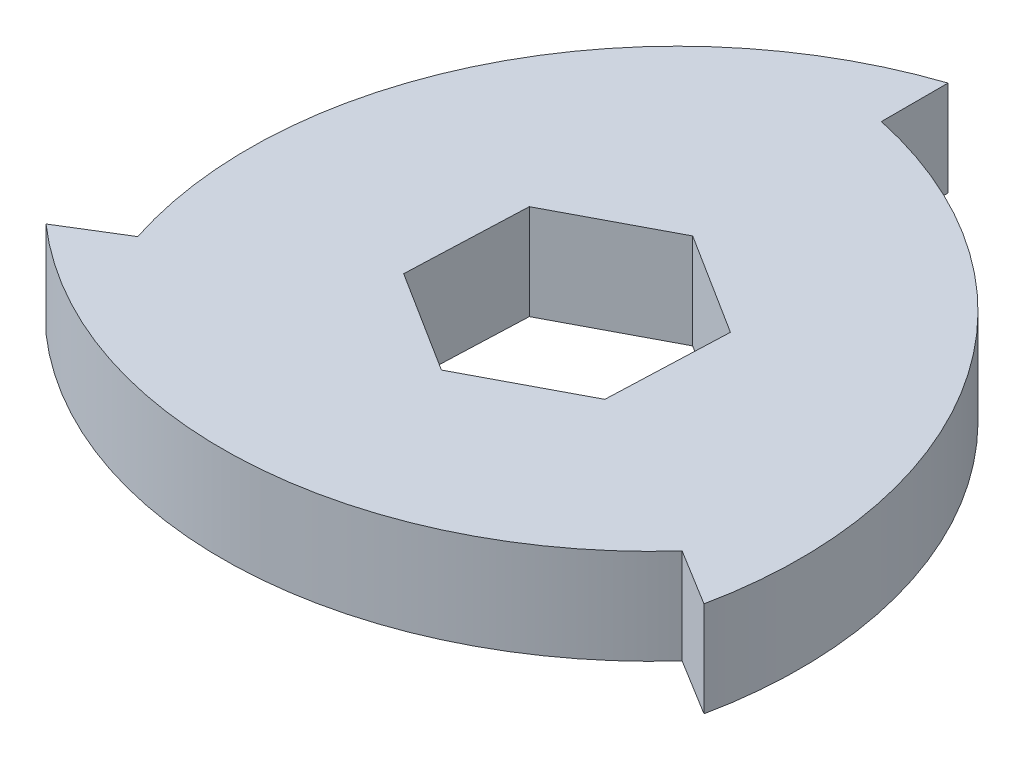
ISO-10303-21;
HEADER;
FILE_DESCRIPTION(('STEP AP214'),'2;1');
FILE_NAME('part.step','',(''),(''),'','','');
FILE_SCHEMA(('AUTOMOTIVE_DESIGN { 1 0 10303 214 1 1 1 1 }'));
ENDSEC;
DATA;
#1=APPLICATION_CONTEXT('core data for automotive mechanical design processes');
#2=APPLICATION_PROTOCOL_DEFINITION('international standard','automotive_design',2000,#1);
#3=PRODUCT_CONTEXT('',#1,'mechanical');
#4=PRODUCT('Part','Part','',(#3));
#5=PRODUCT_RELATED_PRODUCT_CATEGORY('part','',(#4));
#6=PRODUCT_DEFINITION_FORMATION('','',#4);
#7=PRODUCT_DEFINITION_CONTEXT('part definition',#1,'design');
#8=PRODUCT_DEFINITION('design','',#6,#7);
#9=PRODUCT_DEFINITION_SHAPE('','',#8);
#10=(LENGTH_UNIT() NAMED_UNIT(*) SI_UNIT(.MILLI.,.METRE.));
#11=(NAMED_UNIT(*) PLANE_ANGLE_UNIT() SI_UNIT($,.RADIAN.));
#12=(NAMED_UNIT(*) SI_UNIT($,.STERADIAN.) SOLID_ANGLE_UNIT());
#13=UNCERTAINTY_MEASURE_WITH_UNIT(LENGTH_MEASURE(1.E-05),#10,'distance_accuracy_value','');
#14=(GEOMETRIC_REPRESENTATION_CONTEXT(3) GLOBAL_UNCERTAINTY_ASSIGNED_CONTEXT((#13)) GLOBAL_UNIT_ASSIGNED_CONTEXT((#10,
#11,#12)) REPRESENTATION_CONTEXT('',''));
#15=CARTESIAN_POINT('',(0.,0.,0.));
#16=DIRECTION('',(0.,0.,1.));
#17=DIRECTION('',(1.,0.,0.));
#18=AXIS2_PLACEMENT_3D('',#15,#16,#17);
#19=CARTESIAN_POINT('',(0.,10.,0.));
#20=DIRECTION('',(0.,1.,0.));
#21=DIRECTION('',(0.,0.,1.));
#22=AXIS2_PLACEMENT_3D('',#19,#20,#21);
#23=PLANE('',#22);
#24=DIRECTION('',(0.0393377719648959,0.,-0.999225970287421));
#25=VECTOR('',#24,1.);
#26=CARTESIAN_POINT('',(10.9889498495241,10.,0.432615660689758));
#27=LINE('',#26,#25);
#28=CARTESIAN_POINT('',(10.7391175137902,10.,6.77865270380765));
#29=VERTEX_POINT('',#28);
#30=CARTESIAN_POINT('',(11.2387743249217,10.,-5.91322172057992));
#31=VERTEX_POINT('',#30);
#32=EDGE_CURVE('E155',#29,#31,#27,.T.);
#33=ORIENTED_EDGE('',*,*,#32,.F.);
#34=DIRECTION('',(0.885023960372509,0.,-0.465545475293831));
#35=VECTOR('',#34,1.);
#36=CARTESIAN_POINT('',(5.12044978081298,10.,9.73421713752762));
#37=LINE('',#36,#35);
#38=CARTESIAN_POINT('',(-0.502196564937244,10.,12.6918744243876));
#39=VERTEX_POINT('',#38);
#40=EDGE_CURVE('E237',#39,#29,#37,.T.);
#41=ORIENTED_EDGE('',*,*,#40,.F.);
#42=DIRECTION('',(0.845686188407613,0.,0.533680494993589));
#43=VECTOR('',#42,1.);
#44=CARTESIAN_POINT('',(-5.87120880458136,10.,9.30369432997785));
#45=LINE('',#44,#43);
#46=CARTESIAN_POINT('',(-11.2438538325331,10.,5.91322172057993));
#47=VERTEX_POINT('',#46);
#48=EDGE_CURVE('E264',#47,#39,#45,.T.);
#49=ORIENTED_EDGE('',*,*,#48,.F.);
#50=DIRECTION('',(-0.0393377719648957,0.,0.999225970287421));
#51=VECTOR('',#50,1.);
#52=CARTESIAN_POINT('',(-10.9940214967991,10.,-0.43281532253795));
#53=LINE('',#52,#51);
#54=CARTESIAN_POINT('',(-10.7441970214015,10.,-6.77865270380763));
#55=VERTEX_POINT('',#54);
#56=EDGE_CURVE('E261',#55,#47,#53,.T.);
#57=ORIENTED_EDGE('',*,*,#56,.F.);
#58=DIRECTION('',(-0.885023960372509,0.,0.465545475293831));
#59=VECTOR('',#58,1.);
#60=CARTESIAN_POINT('',(-5.12155067565131,10.,-9.7363099906676));
#61=LINE('',#60,#59);
#62=CARTESIAN_POINT('',(0.49711705732587,10.,-12.6918744243876));
#63=VERTEX_POINT('',#62);
#64=EDGE_CURVE('E258',#63,#55,#61,.T.);
#65=ORIENTED_EDGE('',*,*,#64,.F.);
#66=DIRECTION('',(-0.845686188407613,0.,-0.53368049499359));
#67=VECTOR('',#66,1.);
#68=CARTESIAN_POINT('',(5.86976208527761,10.,-9.30140181498965));
#69=LINE('',#68,#67);
#70=EDGE_CURVE('E251',#31,#63,#69,.T.);
#71=ORIENTED_EDGE('',*,*,#70,.F.);
#72=EDGE_LOOP('',(#33,#41,#49,#57,#65,#71));
#73=FACE_BOUND('',#72,.T.);
#74=DIRECTION('',(0.,0.,1.));
#75=VECTOR('',#74,1.);
#76=CARTESIAN_POINT('',(0.,10.,0.));
#77=LINE('',#76,#75);
#78=CARTESIAN_POINT('',(0.,10.,-40.));
#79=VERTEX_POINT('',#78);
#80=CARTESIAN_POINT('',(0.,10.,-33.));
#81=VERTEX_POINT('',#80);
#82=EDGE_CURVE('E281',#79,#81,#77,.T.);
#83=ORIENTED_EDGE('',*,*,#82,.F.);
#84=CARTESIAN_POINT('',(14.246243831083,10.,2.68541362931054));
#85=DIRECTION('',(0.,1.,0.));
#86=DIRECTION('',(0.,0.,1.));
#87=AXIS2_PLACEMENT_3D('',#84,#85,#86);
#88=CIRCLE('',#87,45.);
#89=CARTESIAN_POINT('',(-28.5801082017894,10.,16.5021994913151));
#90=VERTEX_POINT('',#89);
#91=EDGE_CURVE('E293',#90,#79,#88,.F.);
#92=ORIENTED_EDGE('',*,*,#91,.F.);
#93=DIRECTION('',(-0.851877214661231,0.,0.523741549947131));
#94=VECTOR('',#93,1.);
#95=CARTESIAN_POINT('',(-0.476993651270899,10.,-0.775840723533893));
#96=LINE('',#95,#94);
#97=CARTESIAN_POINT('',(-34.543248704418,10.,20.168390340945));
#98=VERTEX_POINT('',#97);
#99=EDGE_CURVE('E296',#90,#98,#96,.T.);
#100=ORIENTED_EDGE('',*,*,#99,.T.);
#101=CARTESIAN_POINT('',(-4.83835516385309,10.,-13.6342619180675));
#102=DIRECTION('',(0.,1.,0.));
#103=DIRECTION('',(0.,0.,1.));
#104=AXIS2_PLACEMENT_3D('',#101,#102,#103);
#105=CIRCLE('',#104,45.0000000000001);
#106=CARTESIAN_POINT('',(28.5801082017892,10.,16.5021994913155));
#107=VERTEX_POINT('',#106);
#108=EDGE_CURVE('E310',#107,#98,#105,.F.);
#109=ORIENTED_EDGE('',*,*,#108,.F.);
#110=DIRECTION('',(0.851877214661262,0.,0.52374154994708));
#111=VECTOR('',#110,1.);
#112=CARTESIAN_POINT('',(0.476993651269617,10.,-0.77584072353191));
#113=LINE('',#112,#111);
#114=CARTESIAN_POINT('',(34.543248704418,10.,20.168390340945));
#115=VERTEX_POINT('',#114);
#116=EDGE_CURVE('E307',#107,#115,#113,.T.);
#117=ORIENTED_EDGE('',*,*,#116,.T.);
#118=CARTESIAN_POINT('',(-9.50947322888466,10.,10.9837460763533));
#119=DIRECTION('',(0.,1.,0.));
#120=DIRECTION('',(0.,0.,1.));
#121=AXIS2_PLACEMENT_3D('',#118,#119,#120);
#122=CIRCLE('',#121,44.9999999999999);
#123=EDGE_CURVE('E284',#81,#115,#122,.F.);
#124=ORIENTED_EDGE('',*,*,#123,.F.);
#125=EDGE_LOOP('',(#83,#92,#100,#109,#117,#124));
#126=FACE_BOUND('',#125,.T.);
#127=ADVANCED_FACE('F140',(#73,#126),#23,.T.);
#128=CARTESIAN_POINT('',(0.,0.,0.));
#129=DIRECTION('',(0.,1.,0.));
#130=DIRECTION('',(0.,0.,1.));
#131=AXIS2_PLACEMENT_3D('',#128,#129,#130);
#132=PLANE('',#131);
#133=DIRECTION('',(-0.885023960372509,0.,0.465545475293831));
#134=VECTOR('',#133,1.);
#135=CARTESIAN_POINT('',(5.12044978081298,0.,9.73421713752762));
#136=LINE('',#135,#134);
#137=CARTESIAN_POINT('',(10.7391175137902,0.,6.77865270380765));
#138=VERTEX_POINT('',#137);
#139=CARTESIAN_POINT('',(-0.502196564937244,0.,12.6918744243876));
#140=VERTEX_POINT('',#139);
#141=EDGE_CURVE('E249',#138,#140,#136,.T.);
#142=ORIENTED_EDGE('',*,*,#141,.F.);
#143=DIRECTION('',(-0.0393377719648959,0.,0.999225970287421));
#144=VECTOR('',#143,1.);
#145=CARTESIAN_POINT('',(10.9889498495241,0.,0.432615660689758));
#146=LINE('',#145,#144);
#147=CARTESIAN_POINT('',(11.2387743249217,0.,-5.91322172057992));
#148=VERTEX_POINT('',#147);
#149=EDGE_CURVE('E231',#148,#138,#146,.T.);
#150=ORIENTED_EDGE('',*,*,#149,.F.);
#151=DIRECTION('',(0.845686188407613,0.,0.53368049499359));
#152=VECTOR('',#151,1.);
#153=CARTESIAN_POINT('',(5.86976208527761,0.,-9.30140181498965));
#154=LINE('',#153,#152);
#155=CARTESIAN_POINT('',(0.49711705732587,0.,-12.6918744243876));
#156=VERTEX_POINT('',#155);
#157=EDGE_CURVE('E240',#156,#148,#154,.T.);
#158=ORIENTED_EDGE('',*,*,#157,.F.);
#159=DIRECTION('',(0.885023960372509,0.,-0.465545475293831));
#160=VECTOR('',#159,1.);
#161=CARTESIAN_POINT('',(-5.12155067565131,0.,-9.7363099906676));
#162=LINE('',#161,#160);
#163=CARTESIAN_POINT('',(-10.7441970214015,0.,-6.77865270380763));
#164=VERTEX_POINT('',#163);
#165=EDGE_CURVE('E163',#164,#156,#162,.T.);
#166=ORIENTED_EDGE('',*,*,#165,.F.);
#167=DIRECTION('',(0.0393377719648957,0.,-0.999225970287421));
#168=VECTOR('',#167,1.);
#169=CARTESIAN_POINT('',(-10.9940214967991,0.,-0.43281532253795));
#170=LINE('',#169,#168);
#171=CARTESIAN_POINT('',(-11.2438538325331,0.,5.91322172057993));
#172=VERTEX_POINT('',#171);
#173=EDGE_CURVE('E441',#172,#164,#170,.T.);
#174=ORIENTED_EDGE('',*,*,#173,.F.);
#175=DIRECTION('',(-0.845686188407613,0.,-0.533680494993589));
#176=VECTOR('',#175,1.);
#177=CARTESIAN_POINT('',(-5.87120880458136,0.,9.30369432997785));
#178=LINE('',#177,#176);
#179=EDGE_CURVE('E253',#140,#172,#178,.T.);
#180=ORIENTED_EDGE('',*,*,#179,.F.);
#181=EDGE_LOOP('',(#142,#150,#158,#166,#174,#180));
#182=FACE_BOUND('',#181,.T.);
#183=CARTESIAN_POINT('',(14.246243831083,0.,2.68541362931054));
#184=DIRECTION('',(0.,1.,0.));
#185=DIRECTION('',(0.,0.,1.));
#186=AXIS2_PLACEMENT_3D('',#183,#184,#185);
#187=CIRCLE('',#186,45.);
#188=CARTESIAN_POINT('',(0.,0.,-40.));
#189=VERTEX_POINT('',#188);
#190=CARTESIAN_POINT('',(-28.5801082017894,0.,16.5021994913151));
#191=VERTEX_POINT('',#190);
#192=EDGE_CURVE('E289',#189,#191,#187,.T.);
#193=ORIENTED_EDGE('',*,*,#192,.F.);
#194=DIRECTION('',(0.,0.,-1.));
#195=VECTOR('',#194,1.);
#196=CARTESIAN_POINT('',(0.,0.,0.));
#197=LINE('',#196,#195);
#198=CARTESIAN_POINT('',(0.,0.,-32.9999999999999));
#199=VERTEX_POINT('',#198);
#200=EDGE_CURVE('E277',#199,#189,#197,.T.);
#201=ORIENTED_EDGE('',*,*,#200,.F.);
#202=CARTESIAN_POINT('',(-9.50947322888466,0.,10.9837460763533));
#203=DIRECTION('',(0.,1.,0.));
#204=DIRECTION('',(0.,0.,1.));
#205=AXIS2_PLACEMENT_3D('',#202,#203,#204);
#206=CIRCLE('',#205,44.9999999999999);
#207=CARTESIAN_POINT('',(34.543248704418,0.,20.168390340945));
#208=VERTEX_POINT('',#207);
#209=EDGE_CURVE('E280',#208,#199,#206,.T.);
#210=ORIENTED_EDGE('',*,*,#209,.F.);
#211=DIRECTION('',(-0.851877214661262,0.,-0.52374154994708));
#212=VECTOR('',#211,1.);
#213=CARTESIAN_POINT('',(0.476993651269617,0.,-0.77584072353191));
#214=LINE('',#213,#212);
#215=CARTESIAN_POINT('',(28.5801082017892,0.,16.5021994913155));
#216=VERTEX_POINT('',#215);
#217=EDGE_CURVE('E292',#208,#216,#214,.T.);
#218=ORIENTED_EDGE('',*,*,#217,.T.);
#219=CARTESIAN_POINT('',(-4.83835516385309,0.,-13.6342619180675));
#220=DIRECTION('',(0.,1.,0.));
#221=DIRECTION('',(0.,0.,1.));
#222=AXIS2_PLACEMENT_3D('',#219,#220,#221);
#223=CIRCLE('',#222,45.0000000000001);
#224=CARTESIAN_POINT('',(-34.5432487044181,0.,20.1683903409448));
#225=VERTEX_POINT('',#224);
#226=EDGE_CURVE('E12',#225,#216,#223,.T.);
#227=ORIENTED_EDGE('',*,*,#226,.F.);
#228=DIRECTION('',(0.851877214661231,0.,-0.523741549947131));
#229=VECTOR('',#228,1.);
#230=CARTESIAN_POINT('',(-0.476993651270899,0.,-0.775840723533893));
#231=LINE('',#230,#229);
#232=EDGE_CURVE('E279',#225,#191,#231,.T.);
#233=ORIENTED_EDGE('',*,*,#232,.T.);
#234=EDGE_LOOP('',(#193,#201,#210,#218,#227,#233));
#235=FACE_BOUND('',#234,.T.);
#236=ADVANCED_FACE('F142',(#182,#235),#132,.F.);
#237=CARTESIAN_POINT('',(0.476993651269617,-0.000999999999999265,-0.77584072353191));
#238=DIRECTION('',(-0.52374154994708,0.,0.851877214661262));
#239=DIRECTION('',(0.851877214661262,0.,0.52374154994708));
#240=AXIS2_PLACEMENT_3D('',#237,#238,#239);
#241=PLANE('',#240);
#242=DIRECTION('',(0.,1.,0.));
#243=VECTOR('',#242,1.);
#244=CARTESIAN_POINT('',(34.543248704418,-0.000999999999999265,20.168390340945));
#245=LINE('',#244,#243);
#246=EDGE_CURVE('E148',#208,#115,#245,.T.);
#247=ORIENTED_EDGE('',*,*,#246,.T.);
#248=ORIENTED_EDGE('',*,*,#116,.F.);
#249=DIRECTION('',(0.,1.,0.));
#250=VECTOR('',#249,1.);
#251=CARTESIAN_POINT('',(28.5801082017892,-0.000999999999999265,16.5021994913155));
#252=LINE('',#251,#250);
#253=EDGE_CURVE('E313',#216,#107,#252,.T.);
#254=ORIENTED_EDGE('',*,*,#253,.F.);
#255=ORIENTED_EDGE('',*,*,#217,.F.);
#256=EDGE_LOOP('',(#247,#248,#254,#255));
#257=FACE_BOUND('',#256,.T.);
#258=ADVANCED_FACE('F325',(#257),#241,.T.);
#259=CARTESIAN_POINT('',(-4.83835516385309,-0.000999999999999265,-13.6342619180675));
#260=DIRECTION('',(0.,1.,0.));
#261=DIRECTION('',(0.,0.,1.));
#262=AXIS2_PLACEMENT_3D('',#259,#260,#261);
#263=CYLINDRICAL_SURFACE('',#262,45.0000000000001);
#264=ORIENTED_EDGE('',*,*,#226,.T.);
#265=ORIENTED_EDGE('',*,*,#253,.T.);
#266=ORIENTED_EDGE('',*,*,#108,.T.);
#267=DIRECTION('',(0.,1.,0.));
#268=VECTOR('',#267,1.);
#269=CARTESIAN_POINT('',(-34.543248704418,-0.000999999999999265,20.168390340945));
#270=LINE('',#269,#268);
#271=EDGE_CURVE('E316',#225,#98,#270,.T.);
#272=ORIENTED_EDGE('',*,*,#271,.F.);
#273=EDGE_LOOP('',(#264,#265,#266,#272));
#274=FACE_BOUND('',#273,.T.);
#275=ADVANCED_FACE('F319',(#274),#263,.T.);
#276=CARTESIAN_POINT('',(-0.476993651270899,-0.000999999999999265,-0.775840723533893));
#277=DIRECTION('',(-0.523741549947131,0.,-0.851877214661231));
#278=DIRECTION('',(-0.851877214661231,0.,0.523741549947131));
#279=AXIS2_PLACEMENT_3D('',#276,#277,#278);
#280=PLANE('',#279);
#281=ORIENTED_EDGE('',*,*,#271,.T.);
#282=ORIENTED_EDGE('',*,*,#99,.F.);
#283=DIRECTION('',(0.,1.,0.));
#284=VECTOR('',#283,1.);
#285=CARTESIAN_POINT('',(-28.5801082017894,-0.000999999999999265,16.5021994913151));
#286=LINE('',#285,#284);
#287=EDGE_CURVE('E294',#191,#90,#286,.T.);
#288=ORIENTED_EDGE('',*,*,#287,.F.);
#289=ORIENTED_EDGE('',*,*,#232,.F.);
#290=EDGE_LOOP('',(#281,#282,#288,#289));
#291=FACE_BOUND('',#290,.T.);
#292=ADVANCED_FACE('F332',(#291),#280,.T.);
#293=CARTESIAN_POINT('',(14.246243831083,-0.000999999999999265,2.68541362931054));
#294=DIRECTION('',(0.,1.,0.));
#295=DIRECTION('',(0.,0.,1.));
#296=AXIS2_PLACEMENT_3D('',#293,#294,#295);
#297=CYLINDRICAL_SURFACE('',#296,45.);
#298=ORIENTED_EDGE('',*,*,#192,.T.);
#299=ORIENTED_EDGE('',*,*,#287,.T.);
#300=ORIENTED_EDGE('',*,*,#91,.T.);
#301=DIRECTION('',(0.,1.,0.));
#302=VECTOR('',#301,1.);
#303=CARTESIAN_POINT('',(0.,-0.000999999999999265,-40.));
#304=LINE('',#303,#302);
#305=EDGE_CURVE('E297',#189,#79,#304,.T.);
#306=ORIENTED_EDGE('',*,*,#305,.F.);
#307=EDGE_LOOP('',(#298,#299,#300,#306));
#308=FACE_BOUND('',#307,.T.);
#309=ADVANCED_FACE('F341',(#308),#297,.T.);
#310=CARTESIAN_POINT('',(0.,-0.000999999999999265,0.));
#311=DIRECTION('',(-1.,0.,0.));
#312=DIRECTION('',(0.,0.,1.));
#313=AXIS2_PLACEMENT_3D('',#310,#311,#312);
#314=PLANE('',#313);
#315=ORIENTED_EDGE('',*,*,#200,.T.);
#316=ORIENTED_EDGE('',*,*,#305,.T.);
#317=ORIENTED_EDGE('',*,*,#82,.T.);
#318=DIRECTION('',(0.,1.,0.));
#319=VECTOR('',#318,1.);
#320=CARTESIAN_POINT('',(0.,-0.000999999999999265,-33.));
#321=LINE('',#320,#319);
#322=EDGE_CURVE('E243',#199,#81,#321,.T.);
#323=ORIENTED_EDGE('',*,*,#322,.F.);
#324=EDGE_LOOP('',(#315,#316,#317,#323));
#325=FACE_BOUND('',#324,.T.);
#326=ADVANCED_FACE('F342',(#325),#314,.F.);
#327=CARTESIAN_POINT('',(-9.50947322888466,-0.000999999999999265,10.9837460763533));
#328=DIRECTION('',(0.,1.,0.));
#329=DIRECTION('',(0.,0.,1.));
#330=AXIS2_PLACEMENT_3D('',#327,#328,#329);
#331=CYLINDRICAL_SURFACE('',#330,44.9999999999999);
#332=ORIENTED_EDGE('',*,*,#209,.T.);
#333=ORIENTED_EDGE('',*,*,#322,.T.);
#334=ORIENTED_EDGE('',*,*,#123,.T.);
#335=ORIENTED_EDGE('',*,*,#246,.F.);
#336=EDGE_LOOP('',(#332,#333,#334,#335));
#337=FACE_BOUND('',#336,.T.);
#338=ADVANCED_FACE('F337',(#337),#331,.T.);
#339=CARTESIAN_POINT('',(10.9889498495241,-0.000999999999999265,0.432615660689758));
#340=DIRECTION('',(0.999225970287421,0.,0.0393377719648959));
#341=DIRECTION('',(0.0393377719648959,0.,-0.999225970287421));
#342=AXIS2_PLACEMENT_3D('',#339,#340,#341);
#343=PLANE('',#342);
#344=ORIENTED_EDGE('',*,*,#149,.T.);
#345=DIRECTION('',(0.,1.,0.));
#346=VECTOR('',#345,1.);
#347=CARTESIAN_POINT('',(10.7391175137902,-0.000999999999999265,6.77865270380765));
#348=LINE('',#347,#346);
#349=EDGE_CURVE('E244',#138,#29,#348,.T.);
#350=ORIENTED_EDGE('',*,*,#349,.T.);
#351=ORIENTED_EDGE('',*,*,#32,.T.);
#352=DIRECTION('',(0.,1.,0.));
#353=VECTOR('',#352,1.);
#354=CARTESIAN_POINT('',(11.2387743249217,-0.000999999999999265,-5.91322172057992));
#355=LINE('',#354,#353);
#356=EDGE_CURVE('E227',#148,#31,#355,.T.);
#357=ORIENTED_EDGE('',*,*,#356,.F.);
#358=EDGE_LOOP('',(#344,#350,#351,#357));
#359=FACE_BOUND('',#358,.T.);
#360=ADVANCED_FACE('F229',(#359),#343,.F.);
#361=CARTESIAN_POINT('',(5.12044978081298,-0.000999999999999265,9.73421713752762));
#362=DIRECTION('',(0.465545475293831,0.,0.885023960372509));
#363=DIRECTION('',(0.885023960372509,0.,-0.465545475293831));
#364=AXIS2_PLACEMENT_3D('',#361,#362,#363);
#365=PLANE('',#364);
#366=ORIENTED_EDGE('',*,*,#141,.T.);
#367=DIRECTION('',(0.,1.,0.));
#368=VECTOR('',#367,1.);
#369=CARTESIAN_POINT('',(-0.502196564937244,-0.000999999999999265,12.6918744243876));
#370=LINE('',#369,#368);
#371=EDGE_CURVE('E270',#140,#39,#370,.T.);
#372=ORIENTED_EDGE('',*,*,#371,.T.);
#373=ORIENTED_EDGE('',*,*,#40,.T.);
#374=ORIENTED_EDGE('',*,*,#349,.F.);
#375=EDGE_LOOP('',(#366,#372,#373,#374));
#376=FACE_BOUND('',#375,.T.);
#377=ADVANCED_FACE('F389',(#376),#365,.F.);
#378=CARTESIAN_POINT('',(-5.87120880458136,-0.000999999999999265,9.30369432997785));
#379=DIRECTION('',(-0.533680494993589,0.,0.845686188407613));
#380=DIRECTION('',(0.845686188407613,0.,0.533680494993589));
#381=AXIS2_PLACEMENT_3D('',#378,#379,#380);
#382=PLANE('',#381);
#383=ORIENTED_EDGE('',*,*,#179,.T.);
#384=DIRECTION('',(0.,1.,0.));
#385=VECTOR('',#384,1.);
#386=CARTESIAN_POINT('',(-11.2438538325331,-0.000999999999999265,5.91322172057993));
#387=LINE('',#386,#385);
#388=EDGE_CURVE('E272',#172,#47,#387,.T.);
#389=ORIENTED_EDGE('',*,*,#388,.T.);
#390=ORIENTED_EDGE('',*,*,#48,.T.);
#391=ORIENTED_EDGE('',*,*,#371,.F.);
#392=EDGE_LOOP('',(#383,#389,#390,#391));
#393=FACE_BOUND('',#392,.T.);
#394=ADVANCED_FACE('F398',(#393),#382,.F.);
#395=CARTESIAN_POINT('',(-10.9940214967991,-0.000999999999999265,-0.43281532253795));
#396=DIRECTION('',(-0.999225970287421,0.,-0.0393377719648957));
#397=DIRECTION('',(-0.0393377719648957,0.,0.999225970287421));
#398=AXIS2_PLACEMENT_3D('',#395,#396,#397);
#399=PLANE('',#398);
#400=ORIENTED_EDGE('',*,*,#173,.T.);
#401=DIRECTION('',(0.,1.,0.));
#402=VECTOR('',#401,1.);
#403=CARTESIAN_POINT('',(-10.7441970214015,-0.000999999999999265,-6.77865270380763));
#404=LINE('',#403,#402);
#405=EDGE_CURVE('E274',#164,#55,#404,.T.);
#406=ORIENTED_EDGE('',*,*,#405,.T.);
#407=ORIENTED_EDGE('',*,*,#56,.T.);
#408=ORIENTED_EDGE('',*,*,#388,.F.);
#409=EDGE_LOOP('',(#400,#406,#407,#408));
#410=FACE_BOUND('',#409,.T.);
#411=ADVANCED_FACE('F408',(#410),#399,.F.);
#412=CARTESIAN_POINT('',(-5.12155067565131,-0.000999999999999265,-9.7363099906676));
#413=DIRECTION('',(-0.465545475293831,0.,-0.885023960372509));
#414=DIRECTION('',(-0.885023960372509,0.,0.465545475293831));
#415=AXIS2_PLACEMENT_3D('',#412,#413,#414);
#416=PLANE('',#415);
#417=ORIENTED_EDGE('',*,*,#165,.T.);
#418=DIRECTION('',(0.,1.,0.));
#419=VECTOR('',#418,1.);
#420=CARTESIAN_POINT('',(0.49711705732587,-0.000999999999999265,-12.6918744243876));
#421=LINE('',#420,#419);
#422=EDGE_CURVE('E236',#156,#63,#421,.T.);
#423=ORIENTED_EDGE('',*,*,#422,.T.);
#424=ORIENTED_EDGE('',*,*,#64,.T.);
#425=ORIENTED_EDGE('',*,*,#405,.F.);
#426=EDGE_LOOP('',(#417,#423,#424,#425));
#427=FACE_BOUND('',#426,.T.);
#428=ADVANCED_FACE('F418',(#427),#416,.F.);
#429=CARTESIAN_POINT('',(5.86976208527761,-0.000999999999999265,-9.30140181498965));
#430=DIRECTION('',(0.53368049499359,0.,-0.845686188407613));
#431=DIRECTION('',(-0.845686188407613,0.,-0.53368049499359));
#432=AXIS2_PLACEMENT_3D('',#429,#430,#431);
#433=PLANE('',#432);
#434=ORIENTED_EDGE('',*,*,#157,.T.);
#435=ORIENTED_EDGE('',*,*,#356,.T.);
#436=ORIENTED_EDGE('',*,*,#70,.T.);
#437=ORIENTED_EDGE('',*,*,#422,.F.);
#438=EDGE_LOOP('',(#434,#435,#436,#437));
#439=FACE_BOUND('',#438,.T.);
#440=ADVANCED_FACE('F241',(#439),#433,.F.);
#441=CLOSED_SHELL('',(#127,#236,#258,#275,#292,#309,#326,#338,#360,#377,#394,#411,#428,#440));
#442=MANIFOLD_SOLID_BREP('B2',#441);
#443=ADVANCED_BREP_SHAPE_REPRESENTATION('',(#18,#442),#14);
#444=SHAPE_DEFINITION_REPRESENTATION(#9,#443);
ENDSEC;
END-ISO-10303-21;
